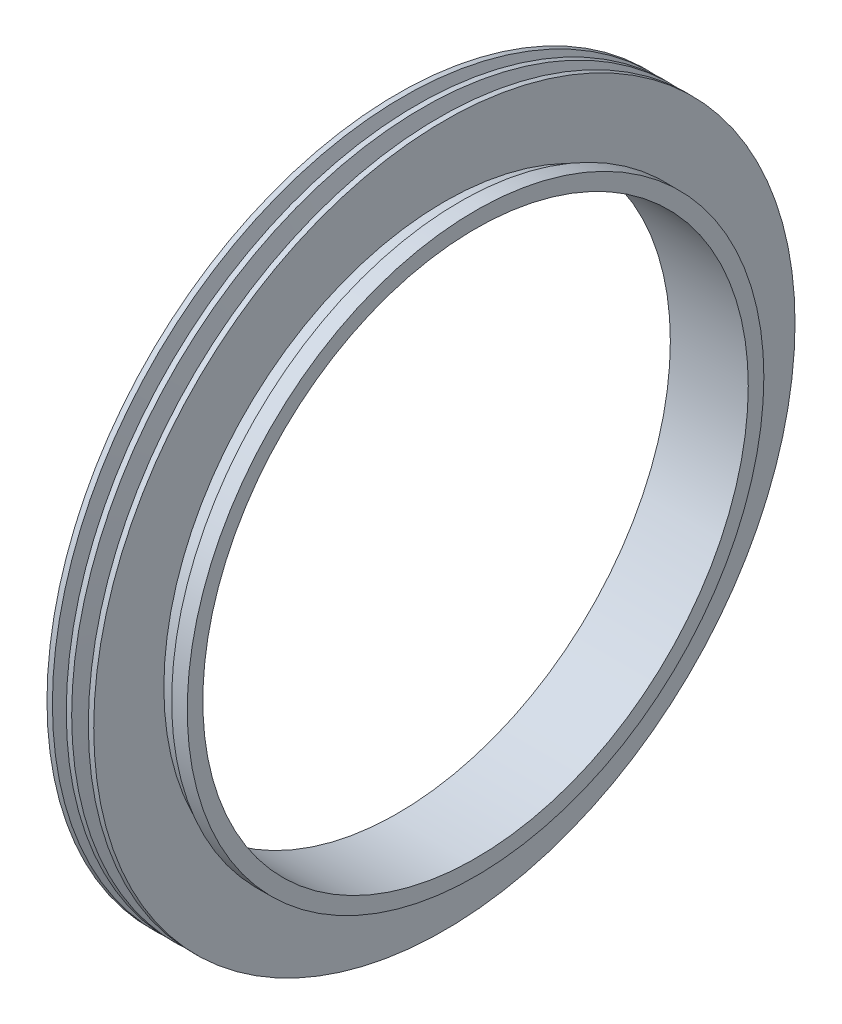
ISO-10303-21;
HEADER;
FILE_DESCRIPTION(('STEP AP214'),'2;1');
FILE_NAME('part.step','',(''),(''),'','','');
FILE_SCHEMA(('AUTOMOTIVE_DESIGN { 1 0 10303 214 1 1 1 1 }'));
ENDSEC;
DATA;
#1=APPLICATION_CONTEXT('core data for automotive mechanical design processes');
#2=APPLICATION_PROTOCOL_DEFINITION('international standard','automotive_design',2000,#1);
#3=PRODUCT_CONTEXT('',#1,'mechanical');
#4=PRODUCT('Part','Part','',(#3));
#5=PRODUCT_RELATED_PRODUCT_CATEGORY('part','',(#4));
#6=PRODUCT_DEFINITION_FORMATION('','',#4);
#7=PRODUCT_DEFINITION_CONTEXT('part definition',#1,'design');
#8=PRODUCT_DEFINITION('design','',#6,#7);
#9=PRODUCT_DEFINITION_SHAPE('','',#8);
#10=(LENGTH_UNIT() NAMED_UNIT(*) SI_UNIT(.MILLI.,.METRE.));
#11=(NAMED_UNIT(*) PLANE_ANGLE_UNIT() SI_UNIT($,.RADIAN.));
#12=(NAMED_UNIT(*) SI_UNIT($,.STERADIAN.) SOLID_ANGLE_UNIT());
#13=UNCERTAINTY_MEASURE_WITH_UNIT(LENGTH_MEASURE(1.E-05),#10,'distance_accuracy_value','');
#14=(GEOMETRIC_REPRESENTATION_CONTEXT(3) GLOBAL_UNCERTAINTY_ASSIGNED_CONTEXT((#13)) GLOBAL_UNIT_ASSIGNED_CONTEXT((#10,
#11,#12)) REPRESENTATION_CONTEXT('',''));
#15=CARTESIAN_POINT('',(0.,0.,0.));
#16=DIRECTION('',(0.,0.,1.));
#17=DIRECTION('',(1.,0.,0.));
#18=AXIS2_PLACEMENT_3D('',#15,#16,#17);
#19=CARTESIAN_POINT('',(0.,0.,0.));
#20=DIRECTION('',(1.,0.,0.));
#21=DIRECTION('',(0.,0.,-1.));
#22=AXIS2_PLACEMENT_3D('',#19,#20,#21);
#23=CYLINDRICAL_SURFACE('',#22,20.9115655773526);
#24=CARTESIAN_POINT('',(-4.28399878372072,0.,0.));
#25=DIRECTION('',(1.,0.,0.));
#26=DIRECTION('',(0.,0.,-1.));
#27=AXIS2_PLACEMENT_3D('',#24,#25,#26);
#28=CIRCLE('',#27,20.9115655773526);
#29=CARTESIAN_POINT('',(-4.28399878372072,0.,-20.9115655773526));
#30=VERTEX_POINT('',#29);
#31=EDGE_CURVE('E10',#30,#30,#28,.T.);
#32=ORIENTED_EDGE('',*,*,#31,.T.);
#33=EDGE_LOOP('',(#32));
#34=FACE_BOUND('',#33,.T.);
#35=CARTESIAN_POINT('',(-4.08170101324582,0.,0.));
#36=DIRECTION('',(1.,0.,0.));
#37=DIRECTION('',(0.,0.,-1.));
#38=AXIS2_PLACEMENT_3D('',#35,#36,#37);
#39=CIRCLE('',#38,20.9115655773526);
#40=CARTESIAN_POINT('',(-4.08170101324582,0.,-20.9115655773526));
#41=VERTEX_POINT('',#40);
#42=EDGE_CURVE('E86',#41,#41,#39,.T.);
#43=ORIENTED_EDGE('',*,*,#42,.F.);
#44=EDGE_LOOP('',(#43));
#45=FACE_BOUND('',#44,.T.);
#46=ADVANCED_FACE('F34',(#34,#45),#23,.T.);
#47=CARTESIAN_POINT('',(-4.28399878372072,0.,0.));
#48=DIRECTION('',(-1.,0.,0.));
#49=DIRECTION('',(0.,0.,1.));
#50=AXIS2_PLACEMENT_3D('',#47,#48,#49);
#51=CONICAL_SURFACE('',#50,20.9115655773526,1.34279968955341);
#52=CARTESIAN_POINT('',(-4.65256506056723,0.,0.));
#53=DIRECTION('',(1.,0.,0.));
#54=DIRECTION('',(0.,0.,-1.));
#55=AXIS2_PLACEMENT_3D('',#52,#53,#54);
#56=CIRCLE('',#55,22.5);
#57=CARTESIAN_POINT('',(-4.65256506056723,0.,-22.5));
#58=VERTEX_POINT('',#57);
#59=EDGE_CURVE('E40',#58,#58,#56,.T.);
#60=ORIENTED_EDGE('',*,*,#59,.T.);
#61=EDGE_LOOP('',(#60));
#62=FACE_BOUND('',#61,.T.);
#63=ORIENTED_EDGE('',*,*,#31,.F.);
#64=EDGE_LOOP('',(#63));
#65=FACE_BOUND('',#64,.T.);
#66=ADVANCED_FACE('F94',(#62,#65),#51,.T.);
#67=CARTESIAN_POINT('',(0.,0.,0.));
#68=DIRECTION('',(1.,0.,0.));
#69=DIRECTION('',(0.,0.,-1.));
#70=AXIS2_PLACEMENT_3D('',#67,#68,#69);
#71=CYLINDRICAL_SURFACE('',#70,22.5);
#72=ORIENTED_EDGE('',*,*,#59,.F.);
#73=EDGE_LOOP('',(#72));
#74=FACE_BOUND('',#73,.T.);
#75=CARTESIAN_POINT('',(-5.,0.,0.));
#76=DIRECTION('',(1.,0.,0.));
#77=DIRECTION('',(0.,0.,-1.));
#78=AXIS2_PLACEMENT_3D('',#75,#76,#77);
#79=CIRCLE('',#78,22.5);
#80=CARTESIAN_POINT('',(-5.,0.,-22.5));
#81=VERTEX_POINT('',#80);
#82=EDGE_CURVE('E44',#81,#81,#79,.T.);
#83=ORIENTED_EDGE('',*,*,#82,.T.);
#84=EDGE_LOOP('',(#83));
#85=FACE_BOUND('',#84,.T.);
#86=ADVANCED_FACE('F98',(#74,#85),#71,.T.);
#87=CARTESIAN_POINT('',(-5.,0.,0.));
#88=DIRECTION('',(1.,0.,0.));
#89=DIRECTION('',(0.,0.,-1.));
#90=AXIS2_PLACEMENT_3D('',#87,#88,#89);
#91=PLANE('',#90);
#92=ORIENTED_EDGE('',*,*,#82,.F.);
#93=EDGE_LOOP('',(#92));
#94=FACE_BOUND('',#93,.T.);
#95=CARTESIAN_POINT('',(-5.,0.,0.));
#96=DIRECTION('',(1.,0.,0.));
#97=DIRECTION('',(0.,0.,-1.));
#98=AXIS2_PLACEMENT_3D('',#95,#96,#97);
#99=CIRCLE('',#98,17.5);
#100=CARTESIAN_POINT('',(-5.,0.,-17.5));
#101=VERTEX_POINT('',#100);
#102=EDGE_CURVE('E48',#101,#101,#99,.T.);
#103=ORIENTED_EDGE('',*,*,#102,.T.);
#104=EDGE_LOOP('',(#103));
#105=FACE_BOUND('',#104,.T.);
#106=ADVANCED_FACE('F102',(#94,#105),#91,.F.);
#107=CARTESIAN_POINT('',(0.,0.,0.));
#108=DIRECTION('',(1.,0.,0.));
#109=DIRECTION('',(0.,0.,-1.));
#110=AXIS2_PLACEMENT_3D('',#107,#108,#109);
#111=CYLINDRICAL_SURFACE('',#110,17.5);
#112=ORIENTED_EDGE('',*,*,#102,.F.);
#113=EDGE_LOOP('',(#112));
#114=FACE_BOUND('',#113,.T.);
#115=CARTESIAN_POINT('',(0.,0.,0.));
#116=DIRECTION('',(1.,0.,0.));
#117=DIRECTION('',(0.,0.,-1.));
#118=AXIS2_PLACEMENT_3D('',#115,#116,#117);
#119=CIRCLE('',#118,17.5);
#120=CARTESIAN_POINT('',(0.,0.,-17.5));
#121=VERTEX_POINT('',#120);
#122=EDGE_CURVE('E53',#121,#121,#119,.T.);
#123=ORIENTED_EDGE('',*,*,#122,.T.);
#124=EDGE_LOOP('',(#123));
#125=FACE_BOUND('',#124,.T.);
#126=ADVANCED_FACE('F109',(#114,#125),#111,.F.);
#127=CARTESIAN_POINT('',(0.,0.,0.));
#128=DIRECTION('',(1.,0.,0.));
#129=DIRECTION('',(0.,0.,-1.));
#130=AXIS2_PLACEMENT_3D('',#127,#128,#129);
#131=PLANE('',#130);
#132=CARTESIAN_POINT('',(0.,0.,0.));
#133=DIRECTION('',(1.,0.,0.));
#134=DIRECTION('',(0.,0.,-1.));
#135=AXIS2_PLACEMENT_3D('',#132,#133,#134);
#136=CIRCLE('',#135,18.5);
#137=CARTESIAN_POINT('',(0.,0.,-18.5));
#138=VERTEX_POINT('',#137);
#139=EDGE_CURVE('E56',#138,#138,#136,.T.);
#140=ORIENTED_EDGE('',*,*,#139,.T.);
#141=EDGE_LOOP('',(#140));
#142=FACE_BOUND('',#141,.T.);
#143=ORIENTED_EDGE('',*,*,#122,.F.);
#144=EDGE_LOOP('',(#143));
#145=FACE_BOUND('',#144,.T.);
#146=ADVANCED_FACE('F113',(#142,#145),#131,.T.);
#147=CARTESIAN_POINT('',(0.,0.,0.));
#148=DIRECTION('',(1.,0.,0.));
#149=DIRECTION('',(0.,0.,-1.));
#150=AXIS2_PLACEMENT_3D('',#147,#148,#149);
#151=CYLINDRICAL_SURFACE('',#150,18.5);
#152=CARTESIAN_POINT('',(-1.,0.,0.));
#153=DIRECTION('',(1.,0.,0.));
#154=DIRECTION('',(0.,0.,-1.));
#155=AXIS2_PLACEMENT_3D('',#152,#153,#154);
#156=CIRCLE('',#155,18.5);
#157=CARTESIAN_POINT('',(-1.,0.,-18.5));
#158=VERTEX_POINT('',#157);
#159=EDGE_CURVE('E59',#158,#158,#156,.T.);
#160=ORIENTED_EDGE('',*,*,#159,.T.);
#161=EDGE_LOOP('',(#160));
#162=FACE_BOUND('',#161,.T.);
#163=ORIENTED_EDGE('',*,*,#139,.F.);
#164=EDGE_LOOP('',(#163));
#165=FACE_BOUND('',#164,.T.);
#166=ADVANCED_FACE('F117',(#162,#165),#151,.T.);
#167=CARTESIAN_POINT('',(-1.,0.,0.));
#168=DIRECTION('',(-1.,0.,0.));
#169=DIRECTION('',(0.,0.,1.));
#170=AXIS2_PLACEMENT_3D('',#167,#168,#169);
#171=PLANE('',#170);
#172=CARTESIAN_POINT('',(-1.,0.,0.));
#173=DIRECTION('',(1.,0.,0.));
#174=DIRECTION('',(0.,0.,-1.));
#175=AXIS2_PLACEMENT_3D('',#172,#173,#174);
#176=CIRCLE('',#175,18.);
#177=CARTESIAN_POINT('',(-1.,0.,-18.));
#178=VERTEX_POINT('',#177);
#179=EDGE_CURVE('E62',#178,#178,#176,.T.);
#180=ORIENTED_EDGE('',*,*,#179,.T.);
#181=EDGE_LOOP('',(#180));
#182=FACE_BOUND('',#181,.T.);
#183=ORIENTED_EDGE('',*,*,#159,.F.);
#184=EDGE_LOOP('',(#183));
#185=FACE_BOUND('',#184,.T.);
#186=ADVANCED_FACE('F121',(#182,#185),#171,.T.);
#187=CARTESIAN_POINT('',(0.,0.,0.));
#188=DIRECTION('',(1.,0.,0.));
#189=DIRECTION('',(0.,0.,-1.));
#190=AXIS2_PLACEMENT_3D('',#187,#188,#189);
#191=CYLINDRICAL_SURFACE('',#190,18.);
#192=CARTESIAN_POINT('',(-2.,0.,0.));
#193=DIRECTION('',(1.,0.,0.));
#194=DIRECTION('',(0.,0.,-1.));
#195=AXIS2_PLACEMENT_3D('',#192,#193,#194);
#196=CIRCLE('',#195,18.);
#197=CARTESIAN_POINT('',(-2.,0.,-18.));
#198=VERTEX_POINT('',#197);
#199=EDGE_CURVE('E65',#198,#198,#196,.T.);
#200=ORIENTED_EDGE('',*,*,#199,.T.);
#201=EDGE_LOOP('',(#200));
#202=FACE_BOUND('',#201,.T.);
#203=ORIENTED_EDGE('',*,*,#179,.F.);
#204=EDGE_LOOP('',(#203));
#205=FACE_BOUND('',#204,.T.);
#206=ADVANCED_FACE('F125',(#202,#205),#191,.T.);
#207=CARTESIAN_POINT('',(-2.,0.,0.));
#208=DIRECTION('',(1.,0.,0.));
#209=DIRECTION('',(0.,0.,-1.));
#210=AXIS2_PLACEMENT_3D('',#207,#208,#209);
#211=PLANE('',#210);
#212=CARTESIAN_POINT('',(-2.,0.,0.));
#213=DIRECTION('',(1.,0.,0.));
#214=DIRECTION('',(0.,0.,-1.));
#215=AXIS2_PLACEMENT_3D('',#212,#213,#214);
#216=CIRCLE('',#215,22.5);
#217=CARTESIAN_POINT('',(-2.,0.,-22.5));
#218=VERTEX_POINT('',#217);
#219=EDGE_CURVE('E68',#218,#218,#216,.T.);
#220=ORIENTED_EDGE('',*,*,#219,.T.);
#221=EDGE_LOOP('',(#220));
#222=FACE_BOUND('',#221,.T.);
#223=ORIENTED_EDGE('',*,*,#199,.F.);
#224=EDGE_LOOP('',(#223));
#225=FACE_BOUND('',#224,.T.);
#226=ADVANCED_FACE('F129',(#222,#225),#211,.T.);
#227=CARTESIAN_POINT('',(0.,0.,0.));
#228=DIRECTION('',(1.,0.,0.));
#229=DIRECTION('',(0.,0.,-1.));
#230=AXIS2_PLACEMENT_3D('',#227,#228,#229);
#231=CYLINDRICAL_SURFACE('',#230,22.5);
#232=CARTESIAN_POINT('',(-2.34743493943277,0.,0.));
#233=DIRECTION('',(1.,0.,0.));
#234=DIRECTION('',(0.,0.,-1.));
#235=AXIS2_PLACEMENT_3D('',#232,#233,#234);
#236=CIRCLE('',#235,22.5);
#237=CARTESIAN_POINT('',(-2.34743493943277,0.,-22.5));
#238=VERTEX_POINT('',#237);
#239=EDGE_CURVE('E71',#238,#238,#236,.T.);
#240=ORIENTED_EDGE('',*,*,#239,.T.);
#241=EDGE_LOOP('',(#240));
#242=FACE_BOUND('',#241,.T.);
#243=ORIENTED_EDGE('',*,*,#219,.F.);
#244=EDGE_LOOP('',(#243));
#245=FACE_BOUND('',#244,.T.);
#246=ADVANCED_FACE('F133',(#242,#245),#231,.T.);
#247=CARTESIAN_POINT('',(-2.34743493943277,0.,0.));
#248=DIRECTION('',(1.,0.,0.));
#249=DIRECTION('',(0.,0.,-1.));
#250=AXIS2_PLACEMENT_3D('',#247,#248,#249);
#251=CONICAL_SURFACE('',#250,22.5,1.23642840877086);
#252=CARTESIAN_POINT('',(-2.8992770526714,0.,0.));
#253=DIRECTION('',(1.,0.,0.));
#254=DIRECTION('',(0.,0.,-1.));
#255=AXIS2_PLACEMENT_3D('',#252,#253,#254);
#256=CIRCLE('',#255,20.9115655773526);
#257=CARTESIAN_POINT('',(-2.8992770526714,0.,-20.9115655773526));
#258=VERTEX_POINT('',#257);
#259=EDGE_CURVE('E74',#258,#258,#256,.T.);
#260=ORIENTED_EDGE('',*,*,#259,.T.);
#261=EDGE_LOOP('',(#260));
#262=FACE_BOUND('',#261,.T.);
#263=ORIENTED_EDGE('',*,*,#239,.F.);
#264=EDGE_LOOP('',(#263));
#265=FACE_BOUND('',#264,.T.);
#266=ADVANCED_FACE('F137',(#262,#265),#251,.T.);
#267=CARTESIAN_POINT('',(0.,0.,0.));
#268=DIRECTION('',(1.,0.,0.));
#269=DIRECTION('',(0.,0.,-1.));
#270=AXIS2_PLACEMENT_3D('',#267,#268,#269);
#271=CYLINDRICAL_SURFACE('',#270,20.9115655773526);
#272=CARTESIAN_POINT('',(-3.1015748231463,0.,0.));
#273=DIRECTION('',(1.,0.,0.));
#274=DIRECTION('',(0.,0.,-1.));
#275=AXIS2_PLACEMENT_3D('',#272,#273,#274);
#276=CIRCLE('',#275,20.9115655773526);
#277=CARTESIAN_POINT('',(-3.1015748231463,0.,-20.9115655773526));
#278=VERTEX_POINT('',#277);
#279=EDGE_CURVE('E77',#278,#278,#276,.T.);
#280=ORIENTED_EDGE('',*,*,#279,.T.);
#281=EDGE_LOOP('',(#280));
#282=FACE_BOUND('',#281,.T.);
#283=ORIENTED_EDGE('',*,*,#259,.F.);
#284=EDGE_LOOP('',(#283));
#285=FACE_BOUND('',#284,.T.);
#286=ADVANCED_FACE('F141',(#282,#285),#271,.T.);
#287=CARTESIAN_POINT('',(-3.1015748231463,0.,0.));
#288=DIRECTION('',(-1.,0.,0.));
#289=DIRECTION('',(0.,0.,1.));
#290=AXIS2_PLACEMENT_3D('',#287,#288,#289);
#291=CONICAL_SURFACE('',#290,20.9115655773526,1.37566653311104);
#292=CARTESIAN_POINT('',(-3.41552041484183,0.,0.));
#293=DIRECTION('',(1.,0.,0.));
#294=DIRECTION('',(0.,0.,-1.));
#295=AXIS2_PLACEMENT_3D('',#292,#293,#294);
#296=CIRCLE('',#295,22.5);
#297=CARTESIAN_POINT('',(-3.41552041484183,0.,-22.5));
#298=VERTEX_POINT('',#297);
#299=EDGE_CURVE('E80',#298,#298,#296,.T.);
#300=ORIENTED_EDGE('',*,*,#299,.T.);
#301=EDGE_LOOP('',(#300));
#302=FACE_BOUND('',#301,.T.);
#303=ORIENTED_EDGE('',*,*,#279,.F.);
#304=EDGE_LOOP('',(#303));
#305=FACE_BOUND('',#304,.T.);
#306=ADVANCED_FACE('F145',(#302,#305),#291,.T.);
#307=CARTESIAN_POINT('',(0.,0.,0.));
#308=DIRECTION('',(1.,0.,0.));
#309=DIRECTION('',(0.,0.,-1.));
#310=AXIS2_PLACEMENT_3D('',#307,#308,#309);
#311=CYLINDRICAL_SURFACE('',#310,22.5);
#312=CARTESIAN_POINT('',(-3.76295535427461,0.,0.));
#313=DIRECTION('',(1.,0.,0.));
#314=DIRECTION('',(0.,0.,-1.));
#315=AXIS2_PLACEMENT_3D('',#312,#313,#314);
#316=CIRCLE('',#315,22.5);
#317=CARTESIAN_POINT('',(-3.76295535427461,0.,-22.5));
#318=VERTEX_POINT('',#317);
#319=EDGE_CURVE('E83',#318,#318,#316,.T.);
#320=ORIENTED_EDGE('',*,*,#319,.T.);
#321=EDGE_LOOP('',(#320));
#322=FACE_BOUND('',#321,.T.);
#323=ORIENTED_EDGE('',*,*,#299,.F.);
#324=EDGE_LOOP('',(#323));
#325=FACE_BOUND('',#324,.T.);
#326=ADVANCED_FACE('F149',(#322,#325),#311,.T.);
#327=CARTESIAN_POINT('',(-3.76295535427461,0.,0.));
#328=DIRECTION('',(1.,0.,0.));
#329=DIRECTION('',(0.,0.,-1.));
#330=AXIS2_PLACEMENT_3D('',#327,#328,#329);
#331=CONICAL_SURFACE('',#330,22.5,1.37275993361027);
#332=ORIENTED_EDGE('',*,*,#42,.T.);
#333=EDGE_LOOP('',(#332));
#334=FACE_BOUND('',#333,.T.);
#335=ORIENTED_EDGE('',*,*,#319,.F.);
#336=EDGE_LOOP('',(#335));
#337=FACE_BOUND('',#336,.T.);
#338=ADVANCED_FACE('F90',(#334,#337),#331,.T.);
#339=CLOSED_SHELL('',(#46,#66,#86,#106,#126,#146,#166,#186,#206,#226,#246,#266,#286,#306,#326,#338));
#340=MANIFOLD_SOLID_BREP('B2',#339);
#341=ADVANCED_BREP_SHAPE_REPRESENTATION('',(#18,#340),#14);
#342=SHAPE_DEFINITION_REPRESENTATION(#9,#341);
ENDSEC;
END-ISO-10303-21;
